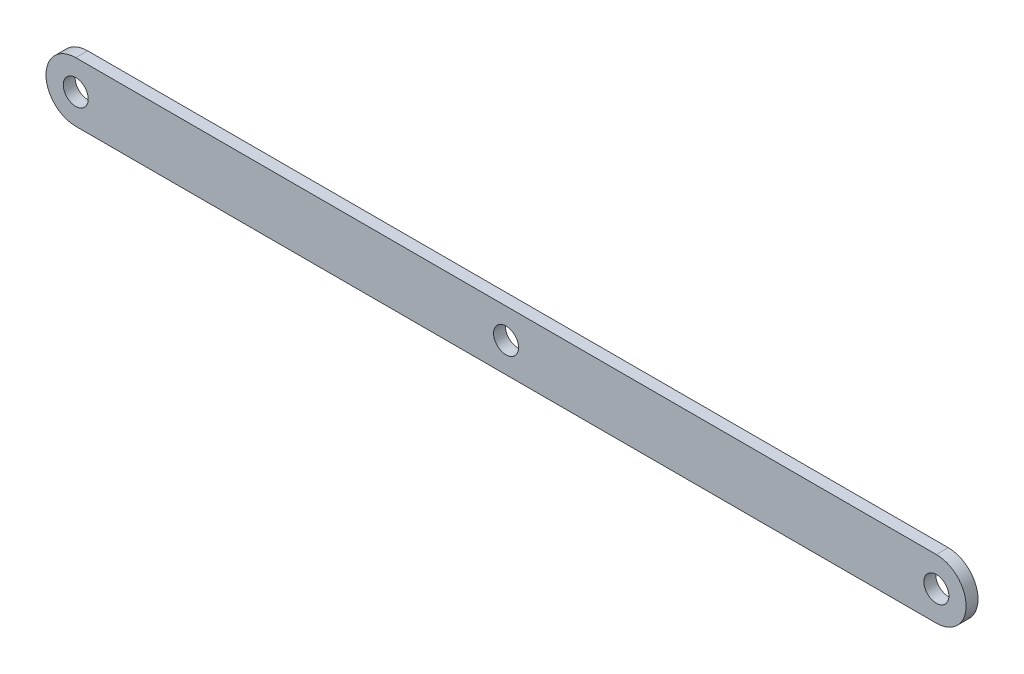
ISO-10303-21;
HEADER;
FILE_DESCRIPTION(('STEP AP214'),'2;1');
FILE_NAME('part.step','',(''),(''),'','','');
FILE_SCHEMA(('AUTOMOTIVE_DESIGN { 1 0 10303 214 1 1 1 1 }'));
ENDSEC;
DATA;
#1=APPLICATION_CONTEXT('core data for automotive mechanical design processes');
#2=APPLICATION_PROTOCOL_DEFINITION('international standard','automotive_design',2000,#1);
#3=PRODUCT_CONTEXT('',#1,'mechanical');
#4=PRODUCT('Part','Part','',(#3));
#5=PRODUCT_RELATED_PRODUCT_CATEGORY('part','',(#4));
#6=PRODUCT_DEFINITION_FORMATION('','',#4);
#7=PRODUCT_DEFINITION_CONTEXT('part definition',#1,'design');
#8=PRODUCT_DEFINITION('design','',#6,#7);
#9=PRODUCT_DEFINITION_SHAPE('','',#8);
#10=(LENGTH_UNIT() NAMED_UNIT(*) SI_UNIT(.MILLI.,.METRE.));
#11=(NAMED_UNIT(*) PLANE_ANGLE_UNIT() SI_UNIT($,.RADIAN.));
#12=(NAMED_UNIT(*) SI_UNIT($,.STERADIAN.) SOLID_ANGLE_UNIT());
#13=UNCERTAINTY_MEASURE_WITH_UNIT(LENGTH_MEASURE(1.E-05),#10,'distance_accuracy_value','');
#14=(GEOMETRIC_REPRESENTATION_CONTEXT(3) GLOBAL_UNCERTAINTY_ASSIGNED_CONTEXT((#13)) GLOBAL_UNIT_ASSIGNED_CONTEXT((#10,
#11,#12)) REPRESENTATION_CONTEXT('',''));
#15=CARTESIAN_POINT('',(0.,0.,0.));
#16=DIRECTION('',(0.,0.,1.));
#17=DIRECTION('',(1.,0.,0.));
#18=AXIS2_PLACEMENT_3D('',#15,#16,#17);
#19=CARTESIAN_POINT('',(72.34,0.,2.));
#20=DIRECTION('',(0.,0.,1.));
#21=DIRECTION('',(1.,0.,0.));
#22=AXIS2_PLACEMENT_3D('',#19,#20,#21);
#23=PLANE('',#22);
#24=CARTESIAN_POINT('',(72.34,0.,2.));
#25=DIRECTION('',(0.,0.,1.));
#26=DIRECTION('',(1.,0.,0.));
#27=AXIS2_PLACEMENT_3D('',#24,#25,#26);
#28=CIRCLE('',#27,2.1);
#29=CARTESIAN_POINT('',(74.44,0.,2.));
#30=VERTEX_POINT('',#29);
#31=EDGE_CURVE('E121',#30,#30,#28,.T.);
#32=ORIENTED_EDGE('',*,*,#31,.F.);
#33=EDGE_LOOP('',(#32));
#34=FACE_BOUND('',#33,.T.);
#35=CARTESIAN_POINT('',(72.34,0.,2.));
#36=DIRECTION('',(0.,0.,1.));
#37=DIRECTION('',(1.,0.,0.));
#38=AXIS2_PLACEMENT_3D('',#35,#36,#37);
#39=CIRCLE('',#38,5.);
#40=CARTESIAN_POINT('',(72.34,-4.99999999999998,2.));
#41=VERTEX_POINT('',#40);
#42=CARTESIAN_POINT('',(72.34,5.00000000000002,2.));
#43=VERTEX_POINT('',#42);
#44=EDGE_CURVE('E91',#41,#43,#39,.T.);
#45=ORIENTED_EDGE('',*,*,#44,.T.);
#46=DIRECTION('',(-1.,0.,0.));
#47=VECTOR('',#46,1.);
#48=CARTESIAN_POINT('',(-72.34,5.,2.));
#49=LINE('',#48,#47);
#50=CARTESIAN_POINT('',(-72.34,5.,2.));
#51=VERTEX_POINT('',#50);
#52=EDGE_CURVE('E86',#43,#51,#49,.T.);
#53=ORIENTED_EDGE('',*,*,#52,.T.);
#54=CARTESIAN_POINT('',(-72.34,0.,2.));
#55=DIRECTION('',(0.,0.,1.));
#56=DIRECTION('',(1.,0.,0.));
#57=AXIS2_PLACEMENT_3D('',#54,#55,#56);
#58=CIRCLE('',#57,5.);
#59=CARTESIAN_POINT('',(-72.34,-5.,2.));
#60=VERTEX_POINT('',#59);
#61=EDGE_CURVE('E89',#51,#60,#58,.T.);
#62=ORIENTED_EDGE('',*,*,#61,.T.);
#63=DIRECTION('',(1.,0.,0.));
#64=VECTOR('',#63,1.);
#65=CARTESIAN_POINT('',(-72.34,-5.,2.));
#66=LINE('',#65,#64);
#67=EDGE_CURVE('E56',#60,#41,#66,.T.);
#68=ORIENTED_EDGE('',*,*,#67,.T.);
#69=EDGE_LOOP('',(#45,#53,#62,#68));
#70=FACE_BOUND('',#69,.T.);
#71=CARTESIAN_POINT('',(-72.34,0.,2.));
#72=DIRECTION('',(0.,0.,1.));
#73=DIRECTION('',(1.,0.,0.));
#74=AXIS2_PLACEMENT_3D('',#71,#72,#73);
#75=CIRCLE('',#74,2.09999999999999);
#76=CARTESIAN_POINT('',(-70.24,0.,2.));
#77=VERTEX_POINT('',#76);
#78=EDGE_CURVE('E106',#77,#77,#75,.T.);
#79=ORIENTED_EDGE('',*,*,#78,.F.);
#80=EDGE_LOOP('',(#79));
#81=FACE_BOUND('',#80,.T.);
#82=CARTESIAN_POINT('',(0.,0.,2.));
#83=DIRECTION('',(0.,0.,1.));
#84=DIRECTION('',(1.,0.,0.));
#85=AXIS2_PLACEMENT_3D('',#82,#83,#84);
#86=CIRCLE('',#85,2.1);
#87=CARTESIAN_POINT('',(2.1,0.,2.));
#88=VERTEX_POINT('',#87);
#89=EDGE_CURVE('E127',#88,#88,#86,.T.);
#90=ORIENTED_EDGE('',*,*,#89,.F.);
#91=EDGE_LOOP('',(#90));
#92=FACE_BOUND('',#91,.T.);
#93=ADVANCED_FACE('F39',(#34,#70,#81,#92),#23,.T.);
#94=CARTESIAN_POINT('',(72.34,0.,0.));
#95=DIRECTION('',(0.,0.,1.));
#96=DIRECTION('',(1.,0.,0.));
#97=AXIS2_PLACEMENT_3D('',#94,#95,#96);
#98=PLANE('',#97);
#99=CARTESIAN_POINT('',(72.34,0.,0.));
#100=DIRECTION('',(0.,0.,1.));
#101=DIRECTION('',(1.,0.,0.));
#102=AXIS2_PLACEMENT_3D('',#99,#100,#101);
#103=CIRCLE('',#102,5.);
#104=CARTESIAN_POINT('',(72.34,-4.99999999999998,0.));
#105=VERTEX_POINT('',#104);
#106=CARTESIAN_POINT('',(72.34,5.00000000000002,0.));
#107=VERTEX_POINT('',#106);
#108=EDGE_CURVE('E103',#105,#107,#103,.T.);
#109=ORIENTED_EDGE('',*,*,#108,.F.);
#110=DIRECTION('',(1.,0.,0.));
#111=VECTOR('',#110,1.);
#112=CARTESIAN_POINT('',(-72.34,-5.,0.));
#113=LINE('',#112,#111);
#114=CARTESIAN_POINT('',(-72.34,-5.,0.));
#115=VERTEX_POINT('',#114);
#116=EDGE_CURVE('E79',#115,#105,#113,.T.);
#117=ORIENTED_EDGE('',*,*,#116,.F.);
#118=CARTESIAN_POINT('',(-72.34,0.,0.));
#119=DIRECTION('',(0.,0.,1.));
#120=DIRECTION('',(1.,0.,0.));
#121=AXIS2_PLACEMENT_3D('',#118,#119,#120);
#122=CIRCLE('',#121,5.);
#123=CARTESIAN_POINT('',(-72.34,5.,0.));
#124=VERTEX_POINT('',#123);
#125=EDGE_CURVE('E73',#124,#115,#122,.T.);
#126=ORIENTED_EDGE('',*,*,#125,.F.);
#127=DIRECTION('',(-1.,0.,0.));
#128=VECTOR('',#127,1.);
#129=CARTESIAN_POINT('',(-72.34,5.,0.));
#130=LINE('',#129,#128);
#131=EDGE_CURVE('E95',#107,#124,#130,.T.);
#132=ORIENTED_EDGE('',*,*,#131,.F.);
#133=EDGE_LOOP('',(#109,#117,#126,#132));
#134=FACE_BOUND('',#133,.T.);
#135=CARTESIAN_POINT('',(-72.34,0.,0.));
#136=DIRECTION('',(0.,0.,1.));
#137=DIRECTION('',(1.,0.,0.));
#138=AXIS2_PLACEMENT_3D('',#135,#136,#137);
#139=CIRCLE('',#138,2.09999999999999);
#140=CARTESIAN_POINT('',(-70.24,0.,0.));
#141=VERTEX_POINT('',#140);
#142=EDGE_CURVE('E118',#141,#141,#139,.T.);
#143=ORIENTED_EDGE('',*,*,#142,.T.);
#144=EDGE_LOOP('',(#143));
#145=FACE_BOUND('',#144,.T.);
#146=CARTESIAN_POINT('',(72.34,0.,0.));
#147=DIRECTION('',(0.,0.,1.));
#148=DIRECTION('',(1.,0.,0.));
#149=AXIS2_PLACEMENT_3D('',#146,#147,#148);
#150=CIRCLE('',#149,2.1);
#151=CARTESIAN_POINT('',(74.44,0.,0.));
#152=VERTEX_POINT('',#151);
#153=EDGE_CURVE('E124',#152,#152,#150,.T.);
#154=ORIENTED_EDGE('',*,*,#153,.T.);
#155=EDGE_LOOP('',(#154));
#156=FACE_BOUND('',#155,.T.);
#157=CARTESIAN_POINT('',(0.,0.,0.));
#158=DIRECTION('',(0.,0.,1.));
#159=DIRECTION('',(1.,0.,0.));
#160=AXIS2_PLACEMENT_3D('',#157,#158,#159);
#161=CIRCLE('',#160,2.1);
#162=CARTESIAN_POINT('',(2.1,0.,0.));
#163=VERTEX_POINT('',#162);
#164=EDGE_CURVE('E130',#163,#163,#161,.T.);
#165=ORIENTED_EDGE('',*,*,#164,.T.);
#166=EDGE_LOOP('',(#165));
#167=FACE_BOUND('',#166,.T.);
#168=ADVANCED_FACE('F114',(#134,#145,#156,#167),#98,.F.);
#169=CARTESIAN_POINT('',(72.34,0.,2.));
#170=DIRECTION('',(0.,0.,-1.));
#171=DIRECTION('',(-1.,0.,0.));
#172=AXIS2_PLACEMENT_3D('',#169,#170,#171);
#173=CYLINDRICAL_SURFACE('',#172,5.);
#174=ORIENTED_EDGE('',*,*,#108,.T.);
#175=DIRECTION('',(0.,0.,-1.));
#176=VECTOR('',#175,1.);
#177=CARTESIAN_POINT('',(72.34,5.00000000000002,2.));
#178=LINE('',#177,#176);
#179=EDGE_CURVE('E11',#43,#107,#178,.T.);
#180=ORIENTED_EDGE('',*,*,#179,.F.);
#181=ORIENTED_EDGE('',*,*,#44,.F.);
#182=DIRECTION('',(0.,0.,-1.));
#183=VECTOR('',#182,1.);
#184=CARTESIAN_POINT('',(72.34,-4.99999999999998,2.));
#185=LINE('',#184,#183);
#186=EDGE_CURVE('E99',#41,#105,#185,.T.);
#187=ORIENTED_EDGE('',*,*,#186,.T.);
#188=EDGE_LOOP('',(#174,#180,#181,#187));
#189=FACE_BOUND('',#188,.T.);
#190=ADVANCED_FACE('F41',(#189),#173,.T.);
#191=CARTESIAN_POINT('',(-72.34,5.,2.));
#192=DIRECTION('',(0.,-1.,0.));
#193=DIRECTION('',(1.,0.,0.));
#194=AXIS2_PLACEMENT_3D('',#191,#192,#193);
#195=PLANE('',#194);
#196=ORIENTED_EDGE('',*,*,#131,.T.);
#197=DIRECTION('',(0.,0.,-1.));
#198=VECTOR('',#197,1.);
#199=CARTESIAN_POINT('',(-72.34,5.,2.));
#200=LINE('',#199,#198);
#201=EDGE_CURVE('E48',#51,#124,#200,.T.);
#202=ORIENTED_EDGE('',*,*,#201,.F.);
#203=ORIENTED_EDGE('',*,*,#52,.F.);
#204=ORIENTED_EDGE('',*,*,#179,.T.);
#205=EDGE_LOOP('',(#196,#202,#203,#204));
#206=FACE_BOUND('',#205,.T.);
#207=ADVANCED_FACE('F94',(#206),#195,.F.);
#208=CARTESIAN_POINT('',(-72.34,0.,2.));
#209=DIRECTION('',(0.,0.,-1.));
#210=DIRECTION('',(-1.,0.,0.));
#211=AXIS2_PLACEMENT_3D('',#208,#209,#210);
#212=CYLINDRICAL_SURFACE('',#211,5.);
#213=ORIENTED_EDGE('',*,*,#125,.T.);
#214=DIRECTION('',(0.,0.,-1.));
#215=VECTOR('',#214,1.);
#216=CARTESIAN_POINT('',(-72.34,-5.,2.));
#217=LINE('',#216,#215);
#218=EDGE_CURVE('E96',#60,#115,#217,.T.);
#219=ORIENTED_EDGE('',*,*,#218,.F.);
#220=ORIENTED_EDGE('',*,*,#61,.F.);
#221=ORIENTED_EDGE('',*,*,#201,.T.);
#222=EDGE_LOOP('',(#213,#219,#220,#221));
#223=FACE_BOUND('',#222,.T.);
#224=ADVANCED_FACE('F97',(#223),#212,.T.);
#225=CARTESIAN_POINT('',(-72.34,-5.,2.));
#226=DIRECTION('',(0.,1.,0.));
#227=DIRECTION('',(-1.,0.,0.));
#228=AXIS2_PLACEMENT_3D('',#225,#226,#227);
#229=PLANE('',#228);
#230=ORIENTED_EDGE('',*,*,#116,.T.);
#231=ORIENTED_EDGE('',*,*,#186,.F.);
#232=ORIENTED_EDGE('',*,*,#67,.F.);
#233=ORIENTED_EDGE('',*,*,#218,.T.);
#234=EDGE_LOOP('',(#230,#231,#232,#233));
#235=FACE_BOUND('',#234,.T.);
#236=ADVANCED_FACE('F111',(#235),#229,.F.);
#237=CARTESIAN_POINT('',(-72.34,0.,2.));
#238=DIRECTION('',(0.,0.,-1.));
#239=DIRECTION('',(-1.,0.,0.));
#240=AXIS2_PLACEMENT_3D('',#237,#238,#239);
#241=CYLINDRICAL_SURFACE('',#240,2.09999999999999);
#242=ORIENTED_EDGE('',*,*,#78,.T.);
#243=EDGE_LOOP('',(#242));
#244=FACE_BOUND('',#243,.T.);
#245=ORIENTED_EDGE('',*,*,#142,.F.);
#246=EDGE_LOOP('',(#245));
#247=FACE_BOUND('',#246,.T.);
#248=ADVANCED_FACE('F148',(#244,#247),#241,.F.);
#249=CARTESIAN_POINT('',(72.34,0.,2.));
#250=DIRECTION('',(0.,0.,-1.));
#251=DIRECTION('',(-1.,0.,0.));
#252=AXIS2_PLACEMENT_3D('',#249,#250,#251);
#253=CYLINDRICAL_SURFACE('',#252,2.1);
#254=ORIENTED_EDGE('',*,*,#31,.T.);
#255=EDGE_LOOP('',(#254));
#256=FACE_BOUND('',#255,.T.);
#257=ORIENTED_EDGE('',*,*,#153,.F.);
#258=EDGE_LOOP('',(#257));
#259=FACE_BOUND('',#258,.T.);
#260=ADVANCED_FACE('F193',(#256,#259),#253,.F.);
#261=CARTESIAN_POINT('',(0.,0.,2.));
#262=DIRECTION('',(0.,0.,-1.));
#263=DIRECTION('',(-1.,0.,0.));
#264=AXIS2_PLACEMENT_3D('',#261,#262,#263);
#265=CYLINDRICAL_SURFACE('',#264,2.1);
#266=ORIENTED_EDGE('',*,*,#89,.T.);
#267=EDGE_LOOP('',(#266));
#268=FACE_BOUND('',#267,.T.);
#269=ORIENTED_EDGE('',*,*,#164,.F.);
#270=EDGE_LOOP('',(#269));
#271=FACE_BOUND('',#270,.T.);
#272=ADVANCED_FACE('F136',(#268,#271),#265,.F.);
#273=CLOSED_SHELL('',(#93,#168,#190,#207,#224,#236,#248,#260,#272));
#274=MANIFOLD_SOLID_BREP('B2',#273);
#275=ADVANCED_BREP_SHAPE_REPRESENTATION('',(#18,#274),#14);
#276=SHAPE_DEFINITION_REPRESENTATION(#9,#275);
ENDSEC;
END-ISO-10303-21;
